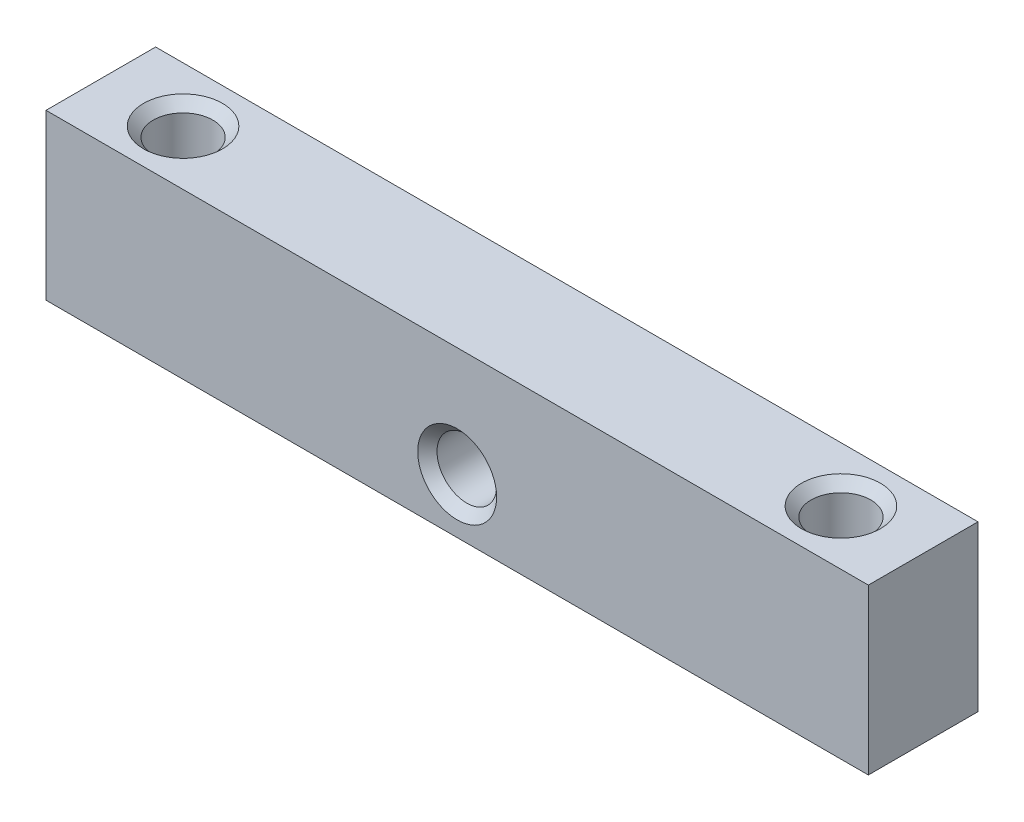
ISO-10303-21;
HEADER;
FILE_DESCRIPTION(('STEP AP214'),'2;1');
FILE_NAME('part.step','',(''),(''),'','','');
FILE_SCHEMA(('AUTOMOTIVE_DESIGN { 1 0 10303 214 1 1 1 1 }'));
ENDSEC;
DATA;
#1=APPLICATION_CONTEXT('core data for automotive mechanical design processes');
#2=APPLICATION_PROTOCOL_DEFINITION('international standard','automotive_design',2000,#1);
#3=PRODUCT_CONTEXT('',#1,'mechanical');
#4=PRODUCT('Part','Part','',(#3));
#5=PRODUCT_RELATED_PRODUCT_CATEGORY('part','',(#4));
#6=PRODUCT_DEFINITION_FORMATION('','',#4);
#7=PRODUCT_DEFINITION_CONTEXT('part definition',#1,'design');
#8=PRODUCT_DEFINITION('design','',#6,#7);
#9=PRODUCT_DEFINITION_SHAPE('','',#8);
#10=(LENGTH_UNIT() NAMED_UNIT(*) SI_UNIT(.MILLI.,.METRE.));
#11=(NAMED_UNIT(*) PLANE_ANGLE_UNIT() SI_UNIT($,.RADIAN.));
#12=(NAMED_UNIT(*) SI_UNIT($,.STERADIAN.) SOLID_ANGLE_UNIT());
#13=UNCERTAINTY_MEASURE_WITH_UNIT(LENGTH_MEASURE(1.E-05),#10,'distance_accuracy_value','');
#14=(GEOMETRIC_REPRESENTATION_CONTEXT(3) GLOBAL_UNCERTAINTY_ASSIGNED_CONTEXT((#13)) GLOBAL_UNIT_ASSIGNED_CONTEXT((#10,
#11,#12)) REPRESENTATION_CONTEXT('',''));
#15=CARTESIAN_POINT('',(0.,0.,0.));
#16=DIRECTION('',(0.,0.,1.));
#17=DIRECTION('',(1.,0.,0.));
#18=AXIS2_PLACEMENT_3D('',#15,#16,#17);
#19=CARTESIAN_POINT('',(23.8125,4.7625,3.175));
#20=DIRECTION('',(0.,0.,-1.));
#21=DIRECTION('',(-1.,0.,0.));
#22=AXIS2_PLACEMENT_3D('',#19,#20,#21);
#23=PLANE('',#22);
#24=DIRECTION('',(0.,-1.,0.));
#25=VECTOR('',#24,1.);
#26=CARTESIAN_POINT('',(-23.8125,4.7625,3.175));
#27=LINE('',#26,#25);
#28=CARTESIAN_POINT('',(-23.8125,4.7625,3.175));
#29=VERTEX_POINT('',#28);
#30=CARTESIAN_POINT('',(-23.8125,-4.7625,3.175));
#31=VERTEX_POINT('',#30);
#32=EDGE_CURVE('E108',#29,#31,#27,.T.);
#33=ORIENTED_EDGE('',*,*,#32,.T.);
#34=DIRECTION('',(-1.,0.,0.));
#35=VECTOR('',#34,1.);
#36=CARTESIAN_POINT('',(23.8125,-4.7625,3.175));
#37=LINE('',#36,#35);
#38=CARTESIAN_POINT('',(23.8125,-4.7625,3.175));
#39=VERTEX_POINT('',#38);
#40=EDGE_CURVE('E12',#39,#31,#37,.T.);
#41=ORIENTED_EDGE('',*,*,#40,.F.);
#42=DIRECTION('',(0.,-1.,0.));
#43=VECTOR('',#42,1.);
#44=CARTESIAN_POINT('',(23.8125,4.7625,3.175));
#45=LINE('',#44,#43);
#46=CARTESIAN_POINT('',(23.8125,4.7625,3.175));
#47=VERTEX_POINT('',#46);
#48=EDGE_CURVE('E96',#47,#39,#45,.T.);
#49=ORIENTED_EDGE('',*,*,#48,.F.);
#50=DIRECTION('',(-1.,0.,0.));
#51=VECTOR('',#50,1.);
#52=CARTESIAN_POINT('',(23.8125,4.7625,3.175));
#53=LINE('',#52,#51);
#54=EDGE_CURVE('E104',#47,#29,#53,.T.);
#55=ORIENTED_EDGE('',*,*,#54,.T.);
#56=EDGE_LOOP('',(#33,#41,#49,#55));
#57=FACE_BOUND('',#56,.T.);
#58=CARTESIAN_POINT('',(0.,-1.5875,3.175));
#59=DIRECTION('',(0.,0.,1.));
#60=DIRECTION('',(1.,0.,0.));
#61=AXIS2_PLACEMENT_3D('',#58,#59,#60);
#62=CIRCLE('',#61,2.286);
#63=CARTESIAN_POINT('',(2.286,-1.5875,3.175));
#64=VERTEX_POINT('',#63);
#65=EDGE_CURVE('E188',#64,#64,#62,.T.);
#66=ORIENTED_EDGE('',*,*,#65,.F.);
#67=EDGE_LOOP('',(#66));
#68=FACE_BOUND('',#67,.T.);
#69=ADVANCED_FACE('F39',(#57,#68),#23,.F.);
#70=CARTESIAN_POINT('',(23.8125,-4.7625,3.175));
#71=DIRECTION('',(0.,1.,0.));
#72=DIRECTION('',(0.,0.,1.));
#73=AXIS2_PLACEMENT_3D('',#70,#71,#72);
#74=PLANE('',#73);
#75=CARTESIAN_POINT('',(19.05,-4.7625,0.));
#76=DIRECTION('',(0.,1.,0.));
#77=DIRECTION('',(0.,0.,1.));
#78=AXIS2_PLACEMENT_3D('',#75,#76,#77);
#79=CIRCLE('',#78,2.286);
#80=CARTESIAN_POINT('',(19.05,-4.7625,2.28599999999999));
#81=VERTEX_POINT('',#80);
#82=EDGE_CURVE('E129',#81,#81,#79,.T.);
#83=ORIENTED_EDGE('',*,*,#82,.T.);
#84=EDGE_LOOP('',(#83));
#85=FACE_BOUND('',#84,.T.);
#86=CARTESIAN_POINT('',(-19.05,-4.7625,0.));
#87=DIRECTION('',(0.,1.,0.));
#88=DIRECTION('',(0.,0.,1.));
#89=AXIS2_PLACEMENT_3D('',#86,#87,#88);
#90=CIRCLE('',#89,2.286);
#91=CARTESIAN_POINT('',(-19.05,-4.7625,2.28599999999999));
#92=VERTEX_POINT('',#91);
#93=EDGE_CURVE('E136',#92,#92,#90,.T.);
#94=ORIENTED_EDGE('',*,*,#93,.T.);
#95=EDGE_LOOP('',(#94));
#96=FACE_BOUND('',#95,.T.);
#97=DIRECTION('',(0.,0.,-1.));
#98=VECTOR('',#97,1.);
#99=CARTESIAN_POINT('',(-23.8125,-4.7625,3.175));
#100=LINE('',#99,#98);
#101=CARTESIAN_POINT('',(-23.8125,-4.7625,-3.175));
#102=VERTEX_POINT('',#101);
#103=EDGE_CURVE('E100',#31,#102,#100,.T.);
#104=ORIENTED_EDGE('',*,*,#103,.T.);
#105=DIRECTION('',(-1.,0.,0.));
#106=VECTOR('',#105,1.);
#107=CARTESIAN_POINT('',(23.8125,-4.7625,-3.175));
#108=LINE('',#107,#106);
#109=CARTESIAN_POINT('',(23.8125,-4.7625,-3.175));
#110=VERTEX_POINT('',#109);
#111=EDGE_CURVE('E47',#110,#102,#108,.T.);
#112=ORIENTED_EDGE('',*,*,#111,.F.);
#113=DIRECTION('',(0.,0.,-1.));
#114=VECTOR('',#113,1.);
#115=CARTESIAN_POINT('',(23.8125,-4.7625,3.175));
#116=LINE('',#115,#114);
#117=EDGE_CURVE('E91',#39,#110,#116,.T.);
#118=ORIENTED_EDGE('',*,*,#117,.F.);
#119=ORIENTED_EDGE('',*,*,#40,.T.);
#120=EDGE_LOOP('',(#104,#112,#118,#119));
#121=FACE_BOUND('',#120,.T.);
#122=ADVANCED_FACE('F99',(#85,#96,#121),#74,.F.);
#123=CARTESIAN_POINT('',(23.8125,4.7625,-3.175));
#124=DIRECTION('',(0.,0.,1.));
#125=DIRECTION('',(1.,0.,0.));
#126=AXIS2_PLACEMENT_3D('',#123,#124,#125);
#127=PLANE('',#126);
#128=CARTESIAN_POINT('',(0.,-1.5875,-3.175));
#129=DIRECTION('',(0.,0.,1.));
#130=DIRECTION('',(1.,0.,0.));
#131=AXIS2_PLACEMENT_3D('',#128,#129,#130);
#132=CIRCLE('',#131,2.286);
#133=CARTESIAN_POINT('',(2.286,-1.5875,-3.175));
#134=VERTEX_POINT('',#133);
#135=EDGE_CURVE('E191',#134,#134,#132,.T.);
#136=ORIENTED_EDGE('',*,*,#135,.T.);
#137=EDGE_LOOP('',(#136));
#138=FACE_BOUND('',#137,.T.);
#139=DIRECTION('',(0.,1.,0.));
#140=VECTOR('',#139,1.);
#141=CARTESIAN_POINT('',(-23.8125,4.7625,-3.175));
#142=LINE('',#141,#140);
#143=CARTESIAN_POINT('',(-23.8125,4.7625,-3.175));
#144=VERTEX_POINT('',#143);
#145=EDGE_CURVE('E76',#102,#144,#142,.T.);
#146=ORIENTED_EDGE('',*,*,#145,.T.);
#147=DIRECTION('',(-1.,0.,0.));
#148=VECTOR('',#147,1.);
#149=CARTESIAN_POINT('',(23.8125,4.7625,-3.175));
#150=LINE('',#149,#148);
#151=CARTESIAN_POINT('',(23.8125,4.7625,-3.175));
#152=VERTEX_POINT('',#151);
#153=EDGE_CURVE('E101',#152,#144,#150,.T.);
#154=ORIENTED_EDGE('',*,*,#153,.F.);
#155=DIRECTION('',(0.,1.,0.));
#156=VECTOR('',#155,1.);
#157=CARTESIAN_POINT('',(23.8125,4.7625,-3.175));
#158=LINE('',#157,#156);
#159=EDGE_CURVE('E94',#110,#152,#158,.T.);
#160=ORIENTED_EDGE('',*,*,#159,.F.);
#161=ORIENTED_EDGE('',*,*,#111,.T.);
#162=EDGE_LOOP('',(#146,#154,#160,#161));
#163=FACE_BOUND('',#162,.T.);
#164=ADVANCED_FACE('F102',(#138,#163),#127,.F.);
#165=CARTESIAN_POINT('',(23.8125,4.7625,3.175));
#166=DIRECTION('',(0.,-1.,0.));
#167=DIRECTION('',(0.,0.,-1.));
#168=AXIS2_PLACEMENT_3D('',#165,#166,#167);
#169=PLANE('',#168);
#170=CARTESIAN_POINT('',(19.05,4.7625,0.));
#171=DIRECTION('',(0.,1.,0.));
#172=DIRECTION('',(0.,0.,1.));
#173=AXIS2_PLACEMENT_3D('',#170,#171,#172);
#174=CIRCLE('',#173,2.286);
#175=CARTESIAN_POINT('',(19.05,4.7625,2.286));
#176=VERTEX_POINT('',#175);
#177=EDGE_CURVE('E122',#176,#176,#174,.T.);
#178=ORIENTED_EDGE('',*,*,#177,.F.);
#179=EDGE_LOOP('',(#178));
#180=FACE_BOUND('',#179,.T.);
#181=CARTESIAN_POINT('',(-19.05,4.7625,0.));
#182=DIRECTION('',(0.,1.,0.));
#183=DIRECTION('',(0.,0.,1.));
#184=AXIS2_PLACEMENT_3D('',#181,#182,#183);
#185=CIRCLE('',#184,2.286);
#186=CARTESIAN_POINT('',(-19.05,4.7625,2.286));
#187=VERTEX_POINT('',#186);
#188=EDGE_CURVE('E138',#187,#187,#185,.T.);
#189=ORIENTED_EDGE('',*,*,#188,.F.);
#190=EDGE_LOOP('',(#189));
#191=FACE_BOUND('',#190,.T.);
#192=DIRECTION('',(0.,0.,1.));
#193=VECTOR('',#192,1.);
#194=CARTESIAN_POINT('',(-23.8125,4.7625,3.175));
#195=LINE('',#194,#193);
#196=EDGE_CURVE('E84',#144,#29,#195,.T.);
#197=ORIENTED_EDGE('',*,*,#196,.T.);
#198=ORIENTED_EDGE('',*,*,#54,.F.);
#199=DIRECTION('',(0.,0.,1.));
#200=VECTOR('',#199,1.);
#201=CARTESIAN_POINT('',(23.8125,4.7625,3.175));
#202=LINE('',#201,#200);
#203=EDGE_CURVE('E55',#152,#47,#202,.T.);
#204=ORIENTED_EDGE('',*,*,#203,.F.);
#205=ORIENTED_EDGE('',*,*,#153,.T.);
#206=EDGE_LOOP('',(#197,#198,#204,#205));
#207=FACE_BOUND('',#206,.T.);
#208=ADVANCED_FACE('F164',(#180,#191,#207),#169,.F.);
#209=CARTESIAN_POINT('',(23.8125,-4.7625,3.175));
#210=DIRECTION('',(1.,0.,0.));
#211=DIRECTION('',(0.,0.,-1.));
#212=AXIS2_PLACEMENT_3D('',#209,#210,#211);
#213=PLANE('',#212);
#214=ORIENTED_EDGE('',*,*,#48,.T.);
#215=ORIENTED_EDGE('',*,*,#117,.T.);
#216=ORIENTED_EDGE('',*,*,#159,.T.);
#217=ORIENTED_EDGE('',*,*,#203,.T.);
#218=EDGE_LOOP('',(#214,#215,#216,#217));
#219=FACE_BOUND('',#218,.T.);
#220=ADVANCED_FACE('F92',(#219),#213,.T.);
#221=CARTESIAN_POINT('',(-23.8125,-4.7625,3.175));
#222=DIRECTION('',(1.,0.,0.));
#223=DIRECTION('',(0.,0.,-1.));
#224=AXIS2_PLACEMENT_3D('',#221,#222,#223);
#225=PLANE('',#224);
#226=ORIENTED_EDGE('',*,*,#32,.F.);
#227=ORIENTED_EDGE('',*,*,#196,.F.);
#228=ORIENTED_EDGE('',*,*,#145,.F.);
#229=ORIENTED_EDGE('',*,*,#103,.F.);
#230=EDGE_LOOP('',(#226,#227,#228,#229));
#231=FACE_BOUND('',#230,.T.);
#232=ADVANCED_FACE('F172',(#231),#225,.F.);
#233=CARTESIAN_POINT('',(-19.05,-4.2037,0.));
#234=DIRECTION('',(0.,-1.,0.));
#235=DIRECTION('',(0.,0.,-1.));
#236=AXIS2_PLACEMENT_3D('',#233,#234,#235);
#237=CONICAL_SURFACE('',#236,1.7272,0.785398163397445);
#238=ORIENTED_EDGE('',*,*,#93,.F.);
#239=EDGE_LOOP('',(#238));
#240=FACE_BOUND('',#239,.T.);
#241=CARTESIAN_POINT('',(-19.05,-4.2037,0.));
#242=DIRECTION('',(0.,1.,0.));
#243=DIRECTION('',(0.,0.,1.));
#244=AXIS2_PLACEMENT_3D('',#241,#242,#243);
#245=CIRCLE('',#244,1.7272);
#246=CARTESIAN_POINT('',(-19.05,-4.2037,1.72719999999999));
#247=VERTEX_POINT('',#246);
#248=EDGE_CURVE('E111',#247,#247,#245,.T.);
#249=ORIENTED_EDGE('',*,*,#248,.T.);
#250=EDGE_LOOP('',(#249));
#251=FACE_BOUND('',#250,.T.);
#252=ADVANCED_FACE('F149',(#240,#251),#237,.F.);
#253=CARTESIAN_POINT('',(-19.05,4.7625,0.));
#254=DIRECTION('',(0.,1.,0.));
#255=DIRECTION('',(0.,0.,1.));
#256=AXIS2_PLACEMENT_3D('',#253,#254,#255);
#257=CYLINDRICAL_SURFACE('',#256,1.7272);
#258=ORIENTED_EDGE('',*,*,#248,.F.);
#259=EDGE_LOOP('',(#258));
#260=FACE_BOUND('',#259,.T.);
#261=CARTESIAN_POINT('',(-19.05,4.2037,0.));
#262=DIRECTION('',(0.,1.,0.));
#263=DIRECTION('',(0.,0.,1.));
#264=AXIS2_PLACEMENT_3D('',#261,#262,#263);
#265=CIRCLE('',#264,1.7272);
#266=CARTESIAN_POINT('',(-19.05,4.2037,1.7272));
#267=VERTEX_POINT('',#266);
#268=EDGE_CURVE('E143',#267,#267,#265,.T.);
#269=ORIENTED_EDGE('',*,*,#268,.T.);
#270=EDGE_LOOP('',(#269));
#271=FACE_BOUND('',#270,.T.);
#272=ADVANCED_FACE('F151',(#260,#271),#257,.F.);
#273=CARTESIAN_POINT('',(-19.05,4.7625,0.));
#274=DIRECTION('',(0.,1.,0.));
#275=DIRECTION('',(0.,0.,1.));
#276=AXIS2_PLACEMENT_3D('',#273,#274,#275);
#277=CONICAL_SURFACE('',#276,2.286,0.785398163397447);
#278=ORIENTED_EDGE('',*,*,#268,.F.);
#279=EDGE_LOOP('',(#278));
#280=FACE_BOUND('',#279,.T.);
#281=ORIENTED_EDGE('',*,*,#188,.T.);
#282=EDGE_LOOP('',(#281));
#283=FACE_BOUND('',#282,.T.);
#284=ADVANCED_FACE('F154',(#280,#283),#277,.F.);
#285=CARTESIAN_POINT('',(19.05,-4.2037,0.));
#286=DIRECTION('',(0.,-1.,0.));
#287=DIRECTION('',(0.,0.,-1.));
#288=AXIS2_PLACEMENT_3D('',#285,#286,#287);
#289=CONICAL_SURFACE('',#288,1.7272,0.785398163397445);
#290=ORIENTED_EDGE('',*,*,#82,.F.);
#291=EDGE_LOOP('',(#290));
#292=FACE_BOUND('',#291,.T.);
#293=CARTESIAN_POINT('',(19.05,-4.2037,0.));
#294=DIRECTION('',(0.,1.,0.));
#295=DIRECTION('',(0.,0.,1.));
#296=AXIS2_PLACEMENT_3D('',#293,#294,#295);
#297=CIRCLE('',#296,1.7272);
#298=CARTESIAN_POINT('',(19.05,-4.2037,1.72719999999999));
#299=VERTEX_POINT('',#298);
#300=EDGE_CURVE('E133',#299,#299,#297,.T.);
#301=ORIENTED_EDGE('',*,*,#300,.T.);
#302=EDGE_LOOP('',(#301));
#303=FACE_BOUND('',#302,.T.);
#304=ADVANCED_FACE('F160',(#292,#303),#289,.F.);
#305=CARTESIAN_POINT('',(19.05,4.7625,0.));
#306=DIRECTION('',(0.,1.,0.));
#307=DIRECTION('',(0.,0.,1.));
#308=AXIS2_PLACEMENT_3D('',#305,#306,#307);
#309=CYLINDRICAL_SURFACE('',#308,1.7272);
#310=ORIENTED_EDGE('',*,*,#300,.F.);
#311=EDGE_LOOP('',(#310));
#312=FACE_BOUND('',#311,.T.);
#313=CARTESIAN_POINT('',(19.05,4.2037,0.));
#314=DIRECTION('',(0.,1.,0.));
#315=DIRECTION('',(0.,0.,1.));
#316=AXIS2_PLACEMENT_3D('',#313,#314,#315);
#317=CIRCLE('',#316,1.7272);
#318=CARTESIAN_POINT('',(19.05,4.2037,1.7272));
#319=VERTEX_POINT('',#318);
#320=EDGE_CURVE('E128',#319,#319,#317,.T.);
#321=ORIENTED_EDGE('',*,*,#320,.T.);
#322=EDGE_LOOP('',(#321));
#323=FACE_BOUND('',#322,.T.);
#324=ADVANCED_FACE('F208',(#312,#323),#309,.F.);
#325=CARTESIAN_POINT('',(19.05,4.7625,0.));
#326=DIRECTION('',(0.,1.,0.));
#327=DIRECTION('',(0.,0.,1.));
#328=AXIS2_PLACEMENT_3D('',#325,#326,#327);
#329=CONICAL_SURFACE('',#328,2.286,0.785398163397447);
#330=ORIENTED_EDGE('',*,*,#320,.F.);
#331=EDGE_LOOP('',(#330));
#332=FACE_BOUND('',#331,.T.);
#333=ORIENTED_EDGE('',*,*,#177,.T.);
#334=EDGE_LOOP('',(#333));
#335=FACE_BOUND('',#334,.T.);
#336=ADVANCED_FACE('F214',(#332,#335),#329,.F.);
#337=CARTESIAN_POINT('',(0.,-1.5875,-2.6162));
#338=DIRECTION('',(0.,0.,-1.));
#339=DIRECTION('',(-1.,0.,0.));
#340=AXIS2_PLACEMENT_3D('',#337,#338,#339);
#341=CONICAL_SURFACE('',#340,1.7272,0.785398163397446);
#342=ORIENTED_EDGE('',*,*,#135,.F.);
#343=EDGE_LOOP('',(#342));
#344=FACE_BOUND('',#343,.T.);
#345=CARTESIAN_POINT('',(0.,-1.5875,-2.6162));
#346=DIRECTION('',(0.,0.,1.));
#347=DIRECTION('',(1.,0.,0.));
#348=AXIS2_PLACEMENT_3D('',#345,#346,#347);
#349=CIRCLE('',#348,1.7272);
#350=CARTESIAN_POINT('',(1.7272,-1.5875,-2.6162));
#351=VERTEX_POINT('',#350);
#352=EDGE_CURVE('E194',#351,#351,#349,.T.);
#353=ORIENTED_EDGE('',*,*,#352,.T.);
#354=EDGE_LOOP('',(#353));
#355=FACE_BOUND('',#354,.T.);
#356=ADVANCED_FACE('F220',(#344,#355),#341,.F.);
#357=CARTESIAN_POINT('',(0.,-1.5875,3.175));
#358=DIRECTION('',(0.,0.,1.));
#359=DIRECTION('',(1.,0.,0.));
#360=AXIS2_PLACEMENT_3D('',#357,#358,#359);
#361=CYLINDRICAL_SURFACE('',#360,1.72719999999999);
#362=ORIENTED_EDGE('',*,*,#352,.F.);
#363=EDGE_LOOP('',(#362));
#364=FACE_BOUND('',#363,.T.);
#365=CARTESIAN_POINT('',(0.,-1.5875,2.6162));
#366=DIRECTION('',(0.,0.,1.));
#367=DIRECTION('',(1.,0.,0.));
#368=AXIS2_PLACEMENT_3D('',#365,#366,#367);
#369=CIRCLE('',#368,1.72719999999999);
#370=CARTESIAN_POINT('',(1.72719999999999,-1.5875,2.6162));
#371=VERTEX_POINT('',#370);
#372=EDGE_CURVE('E190',#371,#371,#369,.T.);
#373=ORIENTED_EDGE('',*,*,#372,.T.);
#374=EDGE_LOOP('',(#373));
#375=FACE_BOUND('',#374,.T.);
#376=ADVANCED_FACE('F225',(#364,#375),#361,.F.);
#377=CARTESIAN_POINT('',(0.,-1.5875,3.175));
#378=DIRECTION('',(0.,0.,1.));
#379=DIRECTION('',(1.,0.,0.));
#380=AXIS2_PLACEMENT_3D('',#377,#378,#379);
#381=CONICAL_SURFACE('',#380,2.286,0.785398163397459);
#382=ORIENTED_EDGE('',*,*,#372,.F.);
#383=EDGE_LOOP('',(#382));
#384=FACE_BOUND('',#383,.T.);
#385=ORIENTED_EDGE('',*,*,#65,.T.);
#386=EDGE_LOOP('',(#385));
#387=FACE_BOUND('',#386,.T.);
#388=ADVANCED_FACE('F279',(#384,#387),#381,.F.);
#389=CLOSED_SHELL('',(#69,#122,#164,#208,#220,#232,#252,#272,#284,#304,#324,#336,#356,#376,#388));
#390=MANIFOLD_SOLID_BREP('B2',#389);
#391=ADVANCED_BREP_SHAPE_REPRESENTATION('',(#18,#390),#14);
#392=SHAPE_DEFINITION_REPRESENTATION(#9,#391);
ENDSEC;
END-ISO-10303-21;
